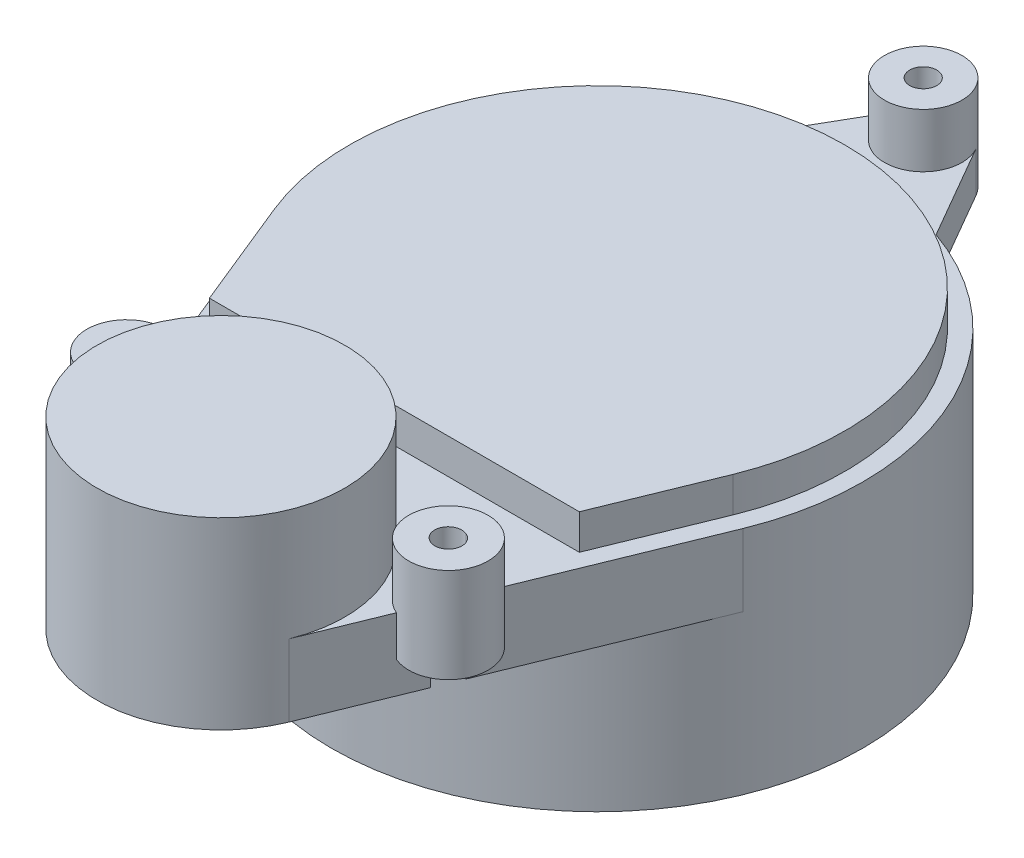
ISO-10303-21;
HEADER;
FILE_DESCRIPTION(('STEP AP214'),'2;1');
FILE_NAME('part.step','',(''),(''),'','','');
FILE_SCHEMA(('AUTOMOTIVE_DESIGN { 1 0 10303 214 1 1 1 1 }'));
ENDSEC;
DATA;
#1=APPLICATION_CONTEXT('core data for automotive mechanical design processes');
#2=APPLICATION_PROTOCOL_DEFINITION('international standard','automotive_design',2000,#1);
#3=PRODUCT_CONTEXT('',#1,'mechanical');
#4=PRODUCT('Part','Part','',(#3));
#5=PRODUCT_RELATED_PRODUCT_CATEGORY('part','',(#4));
#6=PRODUCT_DEFINITION_FORMATION('','',#4);
#7=PRODUCT_DEFINITION_CONTEXT('part definition',#1,'design');
#8=PRODUCT_DEFINITION('design','',#6,#7);
#9=PRODUCT_DEFINITION_SHAPE('','',#8);
#10=(LENGTH_UNIT() NAMED_UNIT(*) SI_UNIT(.MILLI.,.METRE.));
#11=(NAMED_UNIT(*) PLANE_ANGLE_UNIT() SI_UNIT($,.RADIAN.));
#12=(NAMED_UNIT(*) SI_UNIT($,.STERADIAN.) SOLID_ANGLE_UNIT());
#13=UNCERTAINTY_MEASURE_WITH_UNIT(LENGTH_MEASURE(1.E-05),#10,'distance_accuracy_value','');
#14=(GEOMETRIC_REPRESENTATION_CONTEXT(3) GLOBAL_UNCERTAINTY_ASSIGNED_CONTEXT((#13)) GLOBAL_UNIT_ASSIGNED_CONTEXT((#10,
#11,#12)) REPRESENTATION_CONTEXT('',''));
#15=CARTESIAN_POINT('',(0.,0.,0.));
#16=DIRECTION('',(0.,0.,1.));
#17=DIRECTION('',(1.,0.,0.));
#18=AXIS2_PLACEMENT_3D('',#15,#16,#17);
#19=CARTESIAN_POINT('',(0.,6.,3.2185628742515));
#20=DIRECTION('',(0.,1.,0.));
#21=DIRECTION('',(1.,0.,0.));
#22=AXIS2_PLACEMENT_3D('',#19,#20,#21);
#23=PLANE('',#22);
#24=CARTESIAN_POINT('',(0.,6.,-36.2));
#25=DIRECTION('',(0.,1.,0.));
#26=DIRECTION('',(-1.,0.,0.));
#27=AXIS2_PLACEMENT_3D('',#24,#25,#26);
#28=CIRCLE('',#27,4.3);
#29=CARTESIAN_POINT('',(-4.3,6.,-36.2));
#30=VERTEX_POINT('',#29);
#31=EDGE_CURVE('E674',#30,#30,#28,.T.);
#32=ORIENTED_EDGE('',*,*,#31,.T.);
#33=EDGE_LOOP('',(#32));
#34=FACE_BOUND('',#33,.T.);
#35=CARTESIAN_POINT('',(0.,6.,-36.2));
#36=DIRECTION('',(0.,1.,0.));
#37=DIRECTION('',(-1.,0.,0.));
#38=AXIS2_PLACEMENT_3D('',#35,#36,#37);
#39=CIRCLE('',#38,1.5);
#40=CARTESIAN_POINT('',(-1.5,6.,-36.2));
#41=VERTEX_POINT('',#40);
#42=EDGE_CURVE('E278',#41,#41,#39,.T.);
#43=ORIENTED_EDGE('',*,*,#42,.F.);
#44=EDGE_LOOP('',(#43));
#45=FACE_BOUND('',#44,.T.);
#46=ADVANCED_FACE('F15',(#34,#45),#23,.T.);
#47=CARTESIAN_POINT('',(0.,0.,3.2185628742515));
#48=DIRECTION('',(0.,1.,0.));
#49=DIRECTION('',(1.,0.,0.));
#50=AXIS2_PLACEMENT_3D('',#47,#48,#49);
#51=PLANE('',#50);
#52=DIRECTION('',(-0.377245508982036,0.,-0.926113290020657));
#53=VECTOR('',#52,1.);
#54=CARTESIAN_POINT('',(-20.0271998966967,0.,29.0329341317365));
#55=LINE('',#54,#53);
#56=CARTESIAN_POINT('',(-19.5091183292846,0.,30.3047908231251));
#57=VERTEX_POINT('',#56);
#58=CARTESIAN_POINT('',(-19.5092464768446,0.,30.3044762291656));
#59=VERTEX_POINT('',#58);
#60=EDGE_CURVE('E831',#57,#59,#55,.T.);
#61=ORIENTED_EDGE('',*,*,#60,.F.);
#62=CARTESIAN_POINT('',(-17.9,0.,34.4));
#63=DIRECTION('',(0.,1.,0.));
#64=DIRECTION('',(-1.,0.,0.));
#65=AXIS2_PLACEMENT_3D('',#62,#63,#64);
#66=CIRCLE('',#65,4.4);
#67=CARTESIAN_POINT('',(-19.5345313222204,0.,30.3148675227503));
#68=VERTEX_POINT('',#67);
#69=EDGE_CURVE('E723',#57,#68,#66,.T.);
#70=ORIENTED_EDGE('',*,*,#69,.T.);
#71=CARTESIAN_POINT('',(-17.8493662373236,0.,34.3793747052565));
#72=DIRECTION('',(0.,1.,0.));
#73=DIRECTION('',(-1.,0.,0.));
#74=AXIS2_PLACEMENT_3D('',#71,#72,#73);
#75=CIRCLE('',#74,4.4);
#76=EDGE_CURVE('E9',#59,#68,#75,.T.);
#77=ORIENTED_EDGE('',*,*,#76,.F.);
#78=EDGE_LOOP('',(#61,#70,#77));
#79=FACE_BOUND('',#78,.T.);
#80=ADVANCED_FACE('F322',(#79),#51,.F.);
#81=CARTESIAN_POINT('',(0.,6.,3.2185628742515));
#82=DIRECTION('',(0.,1.,0.));
#83=DIRECTION('',(1.,0.,0.));
#84=AXIS2_PLACEMENT_3D('',#81,#82,#83);
#85=PLANE('',#84);
#86=CARTESIAN_POINT('',(-17.9,6.,34.4));
#87=DIRECTION('',(0.,1.,0.));
#88=DIRECTION('',(-1.,0.,0.));
#89=AXIS2_PLACEMENT_3D('',#86,#87,#88);
#90=CIRCLE('',#89,1.5);
#91=CARTESIAN_POINT('',(-18.4148584908716,6.,32.9911278502371));
#92=VERTEX_POINT('',#91);
#93=CARTESIAN_POINT('',(-17.2838739837756,6.,35.7676215602759));
#94=VERTEX_POINT('',#93);
#95=EDGE_CURVE('E706',#92,#94,#90,.T.);
#96=ORIENTED_EDGE('',*,*,#95,.F.);
#97=CARTESIAN_POINT('',(-17.8493662373236,6.,34.3793747052565));
#98=DIRECTION('',(0.,-1.,0.));
#99=DIRECTION('',(1.,0.,0.));
#100=AXIS2_PLACEMENT_3D('',#97,#98,#99);
#101=CIRCLE('',#100,1.49900327527793);
#102=EDGE_CURVE('E268',#92,#94,#101,.T.);
#103=ORIENTED_EDGE('',*,*,#102,.T.);
#104=EDGE_LOOP('',(#96,#103));
#105=FACE_BOUND('',#104,.T.);
#106=CARTESIAN_POINT('',(-17.8493662373236,6.,34.3793747052565));
#107=DIRECTION('',(0.,1.,0.));
#108=DIRECTION('',(-1.,0.,0.));
#109=AXIS2_PLACEMENT_3D('',#106,#107,#108);
#110=CIRCLE('',#109,4.4);
#111=CARTESIAN_POINT('',(-22.2493662373236,6.,34.3793747052565));
#112=VERTEX_POINT('',#111);
#113=EDGE_CURVE('E18',#112,#112,#110,.T.);
#114=ORIENTED_EDGE('',*,*,#113,.T.);
#115=EDGE_LOOP('',(#114));
#116=FACE_BOUND('',#115,.T.);
#117=ADVANCED_FACE('F330',(#105,#116),#85,.T.);
#118=CARTESIAN_POINT('',(-17.8493662373236,6.,34.3793747052565));
#119=DIRECTION('',(0.,-1.,0.));
#120=DIRECTION('',(1.,0.,0.));
#121=AXIS2_PLACEMENT_3D('',#118,#119,#120);
#122=CYLINDRICAL_SURFACE('',#121,4.4);
#123=CARTESIAN_POINT('',(-17.8493662373236,0.,34.3793747052565));
#124=DIRECTION('',(0.,1.,0.));
#125=DIRECTION('',(-1.,0.,0.));
#126=AXIS2_PLACEMENT_3D('',#123,#124,#125);
#127=CIRCLE('',#126,4.4);
#128=CARTESIAN_POINT('',(-16.2148349151032,0.,38.4645071825062));
#129=VERTEX_POINT('',#128);
#130=CARTESIAN_POINT('',(-16.1894859978026,0.,38.4542731813474));
#131=VERTEX_POINT('',#130);
#132=EDGE_CURVE('E297',#129,#131,#127,.T.);
#133=ORIENTED_EDGE('',*,*,#132,.T.);
#134=CARTESIAN_POINT('',(-17.8493662373236,0.,34.3793747052565));
#135=DIRECTION('',(0.,1.,0.));
#136=DIRECTION('',(-1.,0.,0.));
#137=AXIS2_PLACEMENT_3D('',#134,#135,#136);
#138=CIRCLE('',#137,4.4);
#139=EDGE_CURVE('E1059',#131,#59,#138,.T.);
#140=ORIENTED_EDGE('',*,*,#139,.T.);
#141=ORIENTED_EDGE('',*,*,#76,.T.);
#142=CARTESIAN_POINT('',(-17.8493662373236,0.,34.3793747052565));
#143=DIRECTION('',(0.,1.,0.));
#144=DIRECTION('',(-1.,0.,0.));
#145=AXIS2_PLACEMENT_3D('',#142,#143,#144);
#146=CIRCLE('',#145,4.4);
#147=EDGE_CURVE('E1004',#68,#129,#146,.T.);
#148=ORIENTED_EDGE('',*,*,#147,.T.);
#149=EDGE_LOOP('',(#133,#140,#141,#148));
#150=FACE_BOUND('',#149,.T.);
#151=ORIENTED_EDGE('',*,*,#113,.F.);
#152=EDGE_LOOP('',(#151));
#153=FACE_BOUND('',#152,.T.);
#154=ADVANCED_FACE('F338',(#150,#153),#122,.T.);
#155=CARTESIAN_POINT('',(0.,0.,3.2185628742515));
#156=DIRECTION('',(0.,1.,0.));
#157=DIRECTION('',(1.,0.,0.));
#158=AXIS2_PLACEMENT_3D('',#155,#156,#157);
#159=PLANE('',#158);
#160=ORIENTED_EDGE('',*,*,#132,.F.);
#161=CARTESIAN_POINT('',(-17.9,0.,34.4));
#162=DIRECTION('',(0.,1.,0.));
#163=DIRECTION('',(-1.,0.,0.));
#164=AXIS2_PLACEMENT_3D('',#161,#162,#163);
#165=CIRCLE('',#164,4.4);
#166=CARTESIAN_POINT('',(-16.1896141453626,0.,38.4539585873879));
#167=VERTEX_POINT('',#166);
#168=EDGE_CURVE('E731',#129,#167,#165,.T.);
#169=ORIENTED_EDGE('',*,*,#168,.T.);
#170=DIRECTION('',(0.377245508982036,0.,0.926113290020657));
#171=VECTOR('',#170,1.);
#172=CARTESIAN_POINT('',(-20.0271998966967,0.,29.0329341317365));
#173=LINE('',#172,#171);
#174=EDGE_CURVE('E961',#167,#131,#173,.T.);
#175=ORIENTED_EDGE('',*,*,#174,.T.);
#176=EDGE_LOOP('',(#160,#169,#175));
#177=FACE_BOUND('',#176,.T.);
#178=ADVANCED_FACE('F344',(#177),#159,.F.);
#179=CARTESIAN_POINT('',(0.,6.,3.2185628742515));
#180=DIRECTION('',(0.,1.,0.));
#181=DIRECTION('',(1.,0.,0.));
#182=AXIS2_PLACEMENT_3D('',#179,#180,#181);
#183=PLANE('',#182);
#184=CARTESIAN_POINT('',(17.9,6.,34.4));
#185=DIRECTION('',(0.,-1.,0.));
#186=DIRECTION('',(-1.,0.,0.));
#187=AXIS2_PLACEMENT_3D('',#184,#185,#186);
#188=CIRCLE('',#187,4.4);
#189=CARTESIAN_POINT('',(13.5,6.,34.4));
#190=VERTEX_POINT('',#189);
#191=EDGE_CURVE('E40',#190,#190,#188,.T.);
#192=ORIENTED_EDGE('',*,*,#191,.F.);
#193=EDGE_LOOP('',(#192));
#194=FACE_BOUND('',#193,.T.);
#195=CARTESIAN_POINT('',(17.8493662373236,6.,34.3793747052565));
#196=DIRECTION('',(0.,-1.,0.));
#197=DIRECTION('',(1.,0.,0.));
#198=AXIS2_PLACEMENT_3D('',#195,#196,#197);
#199=CIRCLE('',#198,1.49900327527793);
#200=CARTESIAN_POINT('',(17.2838739837756,6.,35.7676215602759));
#201=VERTEX_POINT('',#200);
#202=CARTESIAN_POINT('',(18.4148584908716,6.,32.9911278502371));
#203=VERTEX_POINT('',#202);
#204=EDGE_CURVE('E255',#201,#203,#199,.T.);
#205=ORIENTED_EDGE('',*,*,#204,.T.);
#206=CARTESIAN_POINT('',(17.9,6.,34.4));
#207=DIRECTION('',(0.,-1.,0.));
#208=DIRECTION('',(-1.,0.,0.));
#209=AXIS2_PLACEMENT_3D('',#206,#207,#208);
#210=CIRCLE('',#209,1.5);
#211=EDGE_CURVE('E270',#203,#201,#210,.T.);
#212=ORIENTED_EDGE('',*,*,#211,.T.);
#213=EDGE_LOOP('',(#205,#212));
#214=FACE_BOUND('',#213,.T.);
#215=ADVANCED_FACE('F271',(#194,#214),#183,.T.);
#216=CARTESIAN_POINT('',(-17.8493662373236,110.925936694793,34.3793747052565));
#217=DIRECTION('',(0.,-1.,0.));
#218=DIRECTION('',(1.,0.,0.));
#219=AXIS2_PLACEMENT_3D('',#216,#217,#218);
#220=CYLINDRICAL_SURFACE('',#219,1.49900327527793);
#221=DIRECTION('',(0.,1.,0.));
#222=VECTOR('',#221,1.);
#223=CARTESIAN_POINT('',(-18.4148584908716,-4.5,32.9911278502371));
#224=LINE('',#223,#222);
#225=CARTESIAN_POINT('',(-18.4148584908716,-4.5,32.9911278502371));
#226=VERTEX_POINT('',#225);
#227=EDGE_CURVE('E715',#226,#92,#224,.T.);
#228=ORIENTED_EDGE('',*,*,#227,.F.);
#229=DIRECTION('',(0.,-1.,0.));
#230=VECTOR('',#229,1.);
#231=CARTESIAN_POINT('',(-18.4148584908716,110.925936694793,32.9911278502371));
#232=LINE('',#231,#230);
#233=CARTESIAN_POINT('',(-18.4148584908716,-8.,32.9911278502371));
#234=VERTEX_POINT('',#233);
#235=EDGE_CURVE('E855',#226,#234,#232,.T.);
#236=ORIENTED_EDGE('',*,*,#235,.T.);
#237=CARTESIAN_POINT('',(-17.8493662373236,-8.,34.3793747052565));
#238=DIRECTION('',(0.,-1.,0.));
#239=DIRECTION('',(1.,0.,0.));
#240=AXIS2_PLACEMENT_3D('',#237,#238,#239);
#241=CIRCLE('',#240,1.49900327527793);
#242=CARTESIAN_POINT('',(-17.2838739837756,-8.,35.7676215602759));
#243=VERTEX_POINT('',#242);
#244=EDGE_CURVE('E800',#234,#243,#241,.T.);
#245=ORIENTED_EDGE('',*,*,#244,.T.);
#246=DIRECTION('',(0.,-1.,0.));
#247=VECTOR('',#246,1.);
#248=CARTESIAN_POINT('',(-17.2838739837756,110.925936694793,35.7676215602759));
#249=LINE('',#248,#247);
#250=CARTESIAN_POINT('',(-17.2838739837756,-4.5,35.7676215602759));
#251=VERTEX_POINT('',#250);
#252=EDGE_CURVE('E981',#251,#243,#249,.T.);
#253=ORIENTED_EDGE('',*,*,#252,.F.);
#254=DIRECTION('',(0.,-1.,0.));
#255=VECTOR('',#254,1.);
#256=CARTESIAN_POINT('',(-17.2838739837756,-4.5,35.7676215602759));
#257=LINE('',#256,#255);
#258=EDGE_CURVE('E700',#94,#251,#257,.T.);
#259=ORIENTED_EDGE('',*,*,#258,.F.);
#260=ORIENTED_EDGE('',*,*,#102,.F.);
#261=EDGE_LOOP('',(#228,#236,#245,#253,#259,#260));
#262=FACE_BOUND('',#261,.T.);
#263=ADVANCED_FACE('F356',(#262),#220,.F.);
#264=CARTESIAN_POINT('',(17.8493662373236,110.925936694793,34.3793747052565));
#265=DIRECTION('',(0.,-1.,0.));
#266=DIRECTION('',(1.,0.,0.));
#267=AXIS2_PLACEMENT_3D('',#264,#265,#266);
#268=CYLINDRICAL_SURFACE('',#267,1.49900327527793);
#269=DIRECTION('',(0.,1.,0.));
#270=VECTOR('',#269,1.);
#271=CARTESIAN_POINT('',(17.2838739837756,-4.5,35.7676215602759));
#272=LINE('',#271,#270);
#273=CARTESIAN_POINT('',(17.2838739837756,-4.5,35.7676215602759));
#274=VERTEX_POINT('',#273);
#275=EDGE_CURVE('E260',#274,#201,#272,.T.);
#276=ORIENTED_EDGE('',*,*,#275,.F.);
#277=DIRECTION('',(0.,-1.,0.));
#278=VECTOR('',#277,1.);
#279=CARTESIAN_POINT('',(17.2838739837756,110.925936694793,35.7676215602759));
#280=LINE('',#279,#278);
#281=CARTESIAN_POINT('',(17.2838739837756,-8.,35.7676215602759));
#282=VERTEX_POINT('',#281);
#283=EDGE_CURVE('E952',#274,#282,#280,.T.);
#284=ORIENTED_EDGE('',*,*,#283,.T.);
#285=CARTESIAN_POINT('',(17.8493662373236,-8.,34.3793747052565));
#286=DIRECTION('',(0.,-1.,0.));
#287=DIRECTION('',(1.,0.,0.));
#288=AXIS2_PLACEMENT_3D('',#285,#286,#287);
#289=CIRCLE('',#288,1.49900327527793);
#290=CARTESIAN_POINT('',(18.4148584908716,-8.,32.9911278502371));
#291=VERTEX_POINT('',#290);
#292=EDGE_CURVE('E796',#282,#291,#289,.T.);
#293=ORIENTED_EDGE('',*,*,#292,.T.);
#294=DIRECTION('',(0.,-1.,0.));
#295=VECTOR('',#294,1.);
#296=CARTESIAN_POINT('',(18.4148584908716,110.925936694793,32.9911278502371));
#297=LINE('',#296,#295);
#298=CARTESIAN_POINT('',(18.4148584908716,-4.5,32.9911278502371));
#299=VERTEX_POINT('',#298);
#300=EDGE_CURVE('E825',#299,#291,#297,.T.);
#301=ORIENTED_EDGE('',*,*,#300,.F.);
#302=DIRECTION('',(0.,-1.,0.));
#303=VECTOR('',#302,1.);
#304=CARTESIAN_POINT('',(18.4148584908716,-4.5,32.9911278502371));
#305=LINE('',#304,#303);
#306=EDGE_CURVE('E264',#203,#299,#305,.T.);
#307=ORIENTED_EDGE('',*,*,#306,.F.);
#308=ORIENTED_EDGE('',*,*,#204,.F.);
#309=EDGE_LOOP('',(#276,#284,#293,#301,#307,#308));
#310=FACE_BOUND('',#309,.T.);
#311=ADVANCED_FACE('F257',(#310),#268,.F.);
#312=CARTESIAN_POINT('',(0.,-4.5,3.2185628742515));
#313=DIRECTION('',(0.,1.,0.));
#314=DIRECTION('',(1.,0.,0.));
#315=AXIS2_PLACEMENT_3D('',#312,#313,#314);
#316=PLANE('',#315);
#317=DIRECTION('',(-0.377245508982036,0.,0.926113290020657));
#318=VECTOR('',#317,1.);
#319=CARTESIAN_POINT('',(20.0271998966967,-4.5,29.0329341317365));
#320=LINE('',#319,#318);
#321=CARTESIAN_POINT('',(19.5091183292846,-4.5,30.3047908231251));
#322=VERTEX_POINT('',#321);
#323=EDGE_CURVE('E805',#322,#299,#320,.T.);
#324=ORIENTED_EDGE('',*,*,#323,.F.);
#325=CARTESIAN_POINT('',(17.9,-4.5,34.4));
#326=DIRECTION('',(0.,-1.,0.));
#327=DIRECTION('',(-1.,0.,0.));
#328=AXIS2_PLACEMENT_3D('',#325,#326,#327);
#329=CIRCLE('',#328,4.4);
#330=CARTESIAN_POINT('',(16.1896141453626,-4.5,38.4539585873879));
#331=VERTEX_POINT('',#330);
#332=EDGE_CURVE('E291',#322,#331,#329,.T.);
#333=ORIENTED_EDGE('',*,*,#332,.T.);
#334=DIRECTION('',(-0.377245508982036,0.,0.926113290020657));
#335=VECTOR('',#334,1.);
#336=CARTESIAN_POINT('',(20.0271998966967,-4.5,29.0329341317365));
#337=LINE('',#336,#335);
#338=EDGE_CURVE('E948',#274,#331,#337,.T.);
#339=ORIENTED_EDGE('',*,*,#338,.F.);
#340=CARTESIAN_POINT('',(17.9,-4.5,34.4));
#341=DIRECTION('',(0.,-1.,0.));
#342=DIRECTION('',(-1.,0.,0.));
#343=AXIS2_PLACEMENT_3D('',#340,#341,#342);
#344=CIRCLE('',#343,1.5);
#345=EDGE_CURVE('E276',#299,#274,#344,.T.);
#346=ORIENTED_EDGE('',*,*,#345,.F.);
#347=EDGE_LOOP('',(#324,#333,#339,#346));
#348=FACE_BOUND('',#347,.T.);
#349=ADVANCED_FACE('F370',(#348),#316,.F.);
#350=CARTESIAN_POINT('',(17.9,-4.5,34.4));
#351=DIRECTION('',(0.,1.,0.));
#352=DIRECTION('',(-1.,0.,0.));
#353=AXIS2_PLACEMENT_3D('',#350,#351,#352);
#354=CYLINDRICAL_SURFACE('',#353,4.4);
#355=ORIENTED_EDGE('',*,*,#191,.T.);
#356=EDGE_LOOP('',(#355));
#357=FACE_BOUND('',#356,.T.);
#358=DIRECTION('',(0.,-1.,0.));
#359=VECTOR('',#358,1.);
#360=CARTESIAN_POINT('',(19.5091183292846,-4.5,30.3047908231251));
#361=LINE('',#360,#359);
#362=CARTESIAN_POINT('',(19.5091183292846,0.,30.3047908231251));
#363=VERTEX_POINT('',#362);
#364=EDGE_CURVE('E813',#363,#322,#361,.T.);
#365=ORIENTED_EDGE('',*,*,#364,.F.);
#366=CARTESIAN_POINT('',(17.9,0.,34.4));
#367=DIRECTION('',(0.,-1.,0.));
#368=DIRECTION('',(-1.,0.,0.));
#369=AXIS2_PLACEMENT_3D('',#366,#367,#368);
#370=CIRCLE('',#369,4.4);
#371=CARTESIAN_POINT('',(16.1896141453626,0.,38.4539585873879));
#372=VERTEX_POINT('',#371);
#373=EDGE_CURVE('E1020',#372,#363,#370,.T.);
#374=ORIENTED_EDGE('',*,*,#373,.F.);
#375=DIRECTION('',(0.,1.,0.));
#376=VECTOR('',#375,1.);
#377=CARTESIAN_POINT('',(16.1896141453626,-4.5,38.4539585873879));
#378=LINE('',#377,#376);
#379=EDGE_CURVE('E934',#331,#372,#378,.T.);
#380=ORIENTED_EDGE('',*,*,#379,.F.);
#381=ORIENTED_EDGE('',*,*,#332,.F.);
#382=EDGE_LOOP('',(#365,#374,#380,#381));
#383=FACE_BOUND('',#382,.T.);
#384=ADVANCED_FACE('F374',(#357,#383),#354,.T.);
#385=CARTESIAN_POINT('',(17.9,-4.5,34.4));
#386=DIRECTION('',(0.,1.,0.));
#387=DIRECTION('',(-1.,0.,0.));
#388=AXIS2_PLACEMENT_3D('',#385,#386,#387);
#389=CYLINDRICAL_SURFACE('',#388,1.5);
#390=ORIENTED_EDGE('',*,*,#275,.T.);
#391=ORIENTED_EDGE('',*,*,#211,.F.);
#392=ORIENTED_EDGE('',*,*,#306,.T.);
#393=ORIENTED_EDGE('',*,*,#345,.T.);
#394=EDGE_LOOP('',(#390,#391,#392,#393));
#395=FACE_BOUND('',#394,.T.);
#396=ADVANCED_FACE('F275',(#395),#389,.F.);
#397=CARTESIAN_POINT('',(0.,-4.5,3.2185628742515));
#398=DIRECTION('',(0.,1.,0.));
#399=DIRECTION('',(1.,0.,0.));
#400=AXIS2_PLACEMENT_3D('',#397,#398,#399);
#401=PLANE('',#400);
#402=CARTESIAN_POINT('',(0.,-4.5,-36.2));
#403=DIRECTION('',(0.,1.,0.));
#404=DIRECTION('',(-1.,0.,0.));
#405=AXIS2_PLACEMENT_3D('',#402,#403,#404);
#406=CIRCLE('',#405,1.5);
#407=CARTESIAN_POINT('',(-1.5,-4.5,-36.2));
#408=VERTEX_POINT('',#407);
#409=EDGE_CURVE('E283',#408,#408,#406,.T.);
#410=ORIENTED_EDGE('',*,*,#409,.T.);
#411=EDGE_LOOP('',(#410));
#412=FACE_BOUND('',#411,.T.);
#413=DIRECTION('',(0.5,0.,0.866025403784439));
#414=VECTOR('',#413,1.);
#415=CARTESIAN_POINT('',(6.76241580238355,-4.5,-33.0871522483651));
#416=LINE('',#415,#414);
#417=CARTESIAN_POINT('',(3.72390923627309,-4.5,-38.35));
#418=VERTEX_POINT('',#417);
#419=CARTESIAN_POINT('',(9.80092236849401,-4.5,-27.8243044967301));
#420=VERTEX_POINT('',#419);
#421=EDGE_CURVE('E705',#418,#420,#416,.T.);
#422=ORIENTED_EDGE('',*,*,#421,.T.);
#423=CARTESIAN_POINT('',(0.,-4.5,0.));
#424=DIRECTION('',(0.,-1.,0.));
#425=DIRECTION('',(1.,0.,0.));
#426=AXIS2_PLACEMENT_3D('',#423,#424,#425);
#427=CIRCLE('',#426,29.5);
#428=CARTESIAN_POINT('',(-9.800922368494,-4.5,-27.8243044967301));
#429=VERTEX_POINT('',#428);
#430=EDGE_CURVE('E911',#429,#420,#427,.T.);
#431=ORIENTED_EDGE('',*,*,#430,.F.);
#432=DIRECTION('',(-0.5,0.,0.866025403784439));
#433=VECTOR('',#432,1.);
#434=CARTESIAN_POINT('',(-6.76241580238355,-4.5,-33.0871522483651));
#435=LINE('',#434,#433);
#436=CARTESIAN_POINT('',(-3.72390923627309,-4.5,-38.35));
#437=VERTEX_POINT('',#436);
#438=EDGE_CURVE('E668',#437,#429,#435,.T.);
#439=ORIENTED_EDGE('',*,*,#438,.F.);
#440=CARTESIAN_POINT('',(0.,-4.5,-36.2));
#441=DIRECTION('',(0.,1.,0.));
#442=DIRECTION('',(-1.,0.,0.));
#443=AXIS2_PLACEMENT_3D('',#440,#441,#442);
#444=CIRCLE('',#443,4.3);
#445=EDGE_CURVE('E681',#418,#437,#444,.T.);
#446=ORIENTED_EDGE('',*,*,#445,.F.);
#447=EDGE_LOOP('',(#422,#431,#439,#446));
#448=FACE_BOUND('',#447,.T.);
#449=ADVANCED_FACE('F383',(#412,#448),#401,.F.);
#450=CARTESIAN_POINT('',(0.,-4.5,-36.2));
#451=DIRECTION('',(0.,1.,0.));
#452=DIRECTION('',(-1.,0.,0.));
#453=AXIS2_PLACEMENT_3D('',#450,#451,#452);
#454=CYLINDRICAL_SURFACE('',#453,1.5);
#455=ORIENTED_EDGE('',*,*,#42,.T.);
#456=EDGE_LOOP('',(#455));
#457=FACE_BOUND('',#456,.T.);
#458=ORIENTED_EDGE('',*,*,#409,.F.);
#459=EDGE_LOOP('',(#458));
#460=FACE_BOUND('',#459,.T.);
#461=ADVANCED_FACE('F391',(#457,#460),#454,.F.);
#462=CARTESIAN_POINT('',(-6.76241580238355,-4.5,-33.0871522483651));
#463=DIRECTION('',(-0.866025403784439,0.,-0.5));
#464=DIRECTION('',(-0.5,0.,0.866025403784439));
#465=AXIS2_PLACEMENT_3D('',#462,#463,#464);
#466=PLANE('',#465);
#467=DIRECTION('',(-0.5,0.,0.866025403784439));
#468=VECTOR('',#467,1.);
#469=CARTESIAN_POINT('',(-6.76241580238355,0.,-33.0871522483651));
#470=LINE('',#469,#468);
#471=CARTESIAN_POINT('',(-3.72390923627309,0.,-38.35));
#472=VERTEX_POINT('',#471);
#473=CARTESIAN_POINT('',(-9.80092236849402,0.,-27.8243044967301));
#474=VERTEX_POINT('',#473);
#475=EDGE_CURVE('E1087',#472,#474,#470,.T.);
#476=ORIENTED_EDGE('',*,*,#475,.F.);
#477=DIRECTION('',(0.,1.,0.));
#478=VECTOR('',#477,1.);
#479=CARTESIAN_POINT('',(-3.72390923627309,-4.5,-38.35));
#480=LINE('',#479,#478);
#481=EDGE_CURVE('E689',#437,#472,#480,.T.);
#482=ORIENTED_EDGE('',*,*,#481,.F.);
#483=ORIENTED_EDGE('',*,*,#438,.T.);
#484=DIRECTION('',(0.,1.,0.));
#485=VECTOR('',#484,1.);
#486=CARTESIAN_POINT('',(-9.800922368494,-4.5,-27.8243044967301));
#487=LINE('',#486,#485);
#488=EDGE_CURVE('E924',#429,#474,#487,.T.);
#489=ORIENTED_EDGE('',*,*,#488,.T.);
#490=EDGE_LOOP('',(#476,#482,#483,#489));
#491=FACE_BOUND('',#490,.T.);
#492=ADVANCED_FACE('F400',(#491),#466,.T.);
#493=CARTESIAN_POINT('',(0.,-4.5,-36.2));
#494=DIRECTION('',(0.,1.,0.));
#495=DIRECTION('',(-1.,0.,0.));
#496=AXIS2_PLACEMENT_3D('',#493,#494,#495);
#497=CYLINDRICAL_SURFACE('',#496,4.3);
#498=ORIENTED_EDGE('',*,*,#31,.F.);
#499=EDGE_LOOP('',(#498));
#500=FACE_BOUND('',#499,.T.);
#501=ORIENTED_EDGE('',*,*,#481,.T.);
#502=CARTESIAN_POINT('',(0.,0.,-36.2));
#503=DIRECTION('',(0.,1.,0.));
#504=DIRECTION('',(-1.,0.,0.));
#505=AXIS2_PLACEMENT_3D('',#502,#503,#504);
#506=CIRCLE('',#505,4.3);
#507=CARTESIAN_POINT('',(3.72390923627309,0.,-38.35));
#508=VERTEX_POINT('',#507);
#509=EDGE_CURVE('E1096',#472,#508,#506,.T.);
#510=ORIENTED_EDGE('',*,*,#509,.T.);
#511=DIRECTION('',(0.,1.,0.));
#512=VECTOR('',#511,1.);
#513=CARTESIAN_POINT('',(3.72390923627309,-4.5,-38.35));
#514=LINE('',#513,#512);
#515=EDGE_CURVE('E696',#418,#508,#514,.T.);
#516=ORIENTED_EDGE('',*,*,#515,.F.);
#517=ORIENTED_EDGE('',*,*,#445,.T.);
#518=EDGE_LOOP('',(#501,#510,#516,#517));
#519=FACE_BOUND('',#518,.T.);
#520=ADVANCED_FACE('F409',(#500,#519),#497,.T.);
#521=CARTESIAN_POINT('',(6.76241580238355,-4.5,-33.0871522483651));
#522=DIRECTION('',(-0.866025403784439,0.,0.5));
#523=DIRECTION('',(0.,1.,0.));
#524=AXIS2_PLACEMENT_3D('',#521,#522,#523);
#525=PLANE('',#524);
#526=DIRECTION('',(0.5,0.,0.866025403784439));
#527=VECTOR('',#526,1.);
#528=CARTESIAN_POINT('',(6.76241580238355,0.,-33.0871522483651));
#529=LINE('',#528,#527);
#530=CARTESIAN_POINT('',(9.80092236849402,0.,-27.8243044967301));
#531=VERTEX_POINT('',#530);
#532=EDGE_CURVE('E1010',#508,#531,#529,.T.);
#533=ORIENTED_EDGE('',*,*,#532,.T.);
#534=DIRECTION('',(0.,1.,0.));
#535=VECTOR('',#534,1.);
#536=CARTESIAN_POINT('',(9.80092236849401,-4.5,-27.8243044967301));
#537=LINE('',#536,#535);
#538=EDGE_CURVE('E894',#420,#531,#537,.T.);
#539=ORIENTED_EDGE('',*,*,#538,.F.);
#540=ORIENTED_EDGE('',*,*,#421,.F.);
#541=ORIENTED_EDGE('',*,*,#515,.T.);
#542=EDGE_LOOP('',(#533,#539,#540,#541));
#543=FACE_BOUND('',#542,.T.);
#544=ADVANCED_FACE('F420',(#543),#525,.F.);
#545=CARTESIAN_POINT('',(-17.9,-4.5,34.4));
#546=DIRECTION('',(0.,1.,0.));
#547=DIRECTION('',(-1.,0.,0.));
#548=AXIS2_PLACEMENT_3D('',#545,#546,#547);
#549=CYLINDRICAL_SURFACE('',#548,1.5);
#550=CARTESIAN_POINT('',(-17.9,-4.5,34.4));
#551=DIRECTION('',(0.,1.,0.));
#552=DIRECTION('',(-1.,0.,0.));
#553=AXIS2_PLACEMENT_3D('',#550,#551,#552);
#554=CIRCLE('',#553,1.5);
#555=EDGE_CURVE('E738',#226,#251,#554,.T.);
#556=ORIENTED_EDGE('',*,*,#555,.F.);
#557=ORIENTED_EDGE('',*,*,#227,.T.);
#558=ORIENTED_EDGE('',*,*,#95,.T.);
#559=ORIENTED_EDGE('',*,*,#258,.T.);
#560=EDGE_LOOP('',(#556,#557,#558,#559));
#561=FACE_BOUND('',#560,.T.);
#562=ADVANCED_FACE('F415',(#561),#549,.F.);
#563=CARTESIAN_POINT('',(-17.9,-4.5,34.4));
#564=DIRECTION('',(0.,1.,0.));
#565=DIRECTION('',(-1.,0.,0.));
#566=AXIS2_PLACEMENT_3D('',#563,#564,#565);
#567=CYLINDRICAL_SURFACE('',#566,4.4);
#568=DIRECTION('',(0.,1.,0.));
#569=VECTOR('',#568,1.);
#570=CARTESIAN_POINT('',(-19.5091183292846,-4.5,30.3047908231251));
#571=LINE('',#570,#569);
#572=CARTESIAN_POINT('',(-19.5091183292846,-4.5,30.3047908231251));
#573=VERTEX_POINT('',#572);
#574=EDGE_CURVE('E839',#573,#57,#571,.T.);
#575=ORIENTED_EDGE('',*,*,#574,.F.);
#576=CARTESIAN_POINT('',(-17.9,-4.5,34.4));
#577=DIRECTION('',(0.,1.,0.));
#578=DIRECTION('',(-1.,0.,0.));
#579=AXIS2_PLACEMENT_3D('',#576,#577,#578);
#580=CIRCLE('',#579,4.4);
#581=CARTESIAN_POINT('',(-16.1896141453626,-4.5,38.4539585873879));
#582=VERTEX_POINT('',#581);
#583=EDGE_CURVE('E746',#573,#582,#580,.T.);
#584=ORIENTED_EDGE('',*,*,#583,.T.);
#585=DIRECTION('',(0.,-1.,0.));
#586=VECTOR('',#585,1.);
#587=CARTESIAN_POINT('',(-16.1896141453626,-4.5,38.4539585873879));
#588=LINE('',#587,#586);
#589=EDGE_CURVE('E957',#167,#582,#588,.T.);
#590=ORIENTED_EDGE('',*,*,#589,.F.);
#591=ORIENTED_EDGE('',*,*,#168,.F.);
#592=CARTESIAN_POINT('',(-17.9,0.,34.4));
#593=DIRECTION('',(0.,1.,0.));
#594=DIRECTION('',(-1.,0.,0.));
#595=AXIS2_PLACEMENT_3D('',#592,#593,#594);
#596=CIRCLE('',#595,4.4);
#597=EDGE_CURVE('E998',#68,#129,#596,.T.);
#598=ORIENTED_EDGE('',*,*,#597,.F.);
#599=ORIENTED_EDGE('',*,*,#69,.F.);
#600=EDGE_LOOP('',(#575,#584,#590,#591,#598,#599));
#601=FACE_BOUND('',#600,.T.);
#602=ADVANCED_FACE('F419',(#601),#567,.T.);
#603=CARTESIAN_POINT('',(0.,-4.5,3.2185628742515));
#604=DIRECTION('',(0.,1.,0.));
#605=DIRECTION('',(1.,0.,0.));
#606=AXIS2_PLACEMENT_3D('',#603,#604,#605);
#607=PLANE('',#606);
#608=ORIENTED_EDGE('',*,*,#583,.F.);
#609=DIRECTION('',(0.377245508982036,0.,0.926113290020657));
#610=VECTOR('',#609,1.);
#611=CARTESIAN_POINT('',(-20.0271998966967,-4.5,29.0329341317365));
#612=LINE('',#611,#610);
#613=EDGE_CURVE('E847',#573,#226,#612,.T.);
#614=ORIENTED_EDGE('',*,*,#613,.T.);
#615=ORIENTED_EDGE('',*,*,#555,.T.);
#616=DIRECTION('',(0.377245508982036,0.,0.926113290020657));
#617=VECTOR('',#616,1.);
#618=CARTESIAN_POINT('',(-20.0271998966967,-4.5,29.0329341317365));
#619=LINE('',#618,#617);
#620=EDGE_CURVE('E989',#251,#582,#619,.T.);
#621=ORIENTED_EDGE('',*,*,#620,.T.);
#622=EDGE_LOOP('',(#608,#614,#615,#621));
#623=FACE_BOUND('',#622,.T.);
#624=ADVANCED_FACE('F429',(#623),#607,.F.);
#625=CARTESIAN_POINT('',(0.,3.9,8.7185628742515));
#626=DIRECTION('',(0.,1.,0.));
#627=DIRECTION('',(1.,0.,0.));
#628=AXIS2_PLACEMENT_3D('',#625,#626,#627);
#629=PLANE('',#628);
#630=DIRECTION('',(-0.377245508982036,0.,-0.926113290020656));
#631=VECTOR('',#630,1.);
#632=CARTESIAN_POINT('',(-22.998447771254,3.9,16.437125748503));
#633=LINE('',#632,#631);
#634=CARTESIAN_POINT('',(-20.5287800669399,3.9,22.5));
#635=VERTEX_POINT('',#634);
#636=CARTESIAN_POINT('',(-25.468115475568,3.9,10.374251497006));
#637=VERTEX_POINT('',#636);
#638=EDGE_CURVE('E781',#635,#637,#633,.T.);
#639=ORIENTED_EDGE('',*,*,#638,.F.);
#640=DIRECTION('',(1.,0.,0.));
#641=VECTOR('',#640,1.);
#642=CARTESIAN_POINT('',(0.,3.9,22.5));
#643=LINE('',#642,#641);
#644=CARTESIAN_POINT('',(20.5287800669399,3.9,22.5));
#645=VERTEX_POINT('',#644);
#646=EDGE_CURVE('E759',#635,#645,#643,.T.);
#647=ORIENTED_EDGE('',*,*,#646,.T.);
#648=DIRECTION('',(0.377245508982036,0.,-0.926113290020657));
#649=VECTOR('',#648,1.);
#650=CARTESIAN_POINT('',(22.998447771254,3.9,16.437125748503));
#651=LINE('',#650,#649);
#652=CARTESIAN_POINT('',(25.468115475568,3.9,10.374251497006));
#653=VERTEX_POINT('',#652);
#654=EDGE_CURVE('E755',#645,#653,#651,.T.);
#655=ORIENTED_EDGE('',*,*,#654,.T.);
#656=CARTESIAN_POINT('',(0.,3.9,0.));
#657=DIRECTION('',(0.,-1.,0.));
#658=DIRECTION('',(-1.,0.,0.));
#659=AXIS2_PLACEMENT_3D('',#656,#657,#658);
#660=CIRCLE('',#659,27.5);
#661=EDGE_CURVE('E750',#637,#653,#660,.T.);
#662=ORIENTED_EDGE('',*,*,#661,.F.);
#663=EDGE_LOOP('',(#639,#647,#655,#662));
#664=FACE_BOUND('',#663,.T.);
#665=ADVANCED_FACE('F438',(#664),#629,.T.);
#666=CARTESIAN_POINT('',(0.,3.9,0.));
#667=DIRECTION('',(0.,-1.,0.));
#668=DIRECTION('',(1.,0.,0.));
#669=AXIS2_PLACEMENT_3D('',#666,#667,#668);
#670=CYLINDRICAL_SURFACE('',#669,27.5);
#671=CARTESIAN_POINT('',(0.,0.,0.));
#672=DIRECTION('',(0.,-1.,0.));
#673=DIRECTION('',(-1.,0.,0.));
#674=AXIS2_PLACEMENT_3D('',#671,#672,#673);
#675=CIRCLE('',#674,27.5);
#676=CARTESIAN_POINT('',(-25.468115475568,0.,10.374251497006));
#677=VERTEX_POINT('',#676);
#678=CARTESIAN_POINT('',(25.468115475568,0.,10.374251497006));
#679=VERTEX_POINT('',#678);
#680=EDGE_CURVE('E1113',#677,#679,#675,.T.);
#681=ORIENTED_EDGE('',*,*,#680,.F.);
#682=DIRECTION('',(0.,-1.,0.));
#683=VECTOR('',#682,1.);
#684=CARTESIAN_POINT('',(-25.468115475568,3.9,10.374251497006));
#685=LINE('',#684,#683);
#686=EDGE_CURVE('E774',#637,#677,#685,.T.);
#687=ORIENTED_EDGE('',*,*,#686,.F.);
#688=ORIENTED_EDGE('',*,*,#661,.T.);
#689=DIRECTION('',(0.,-1.,0.));
#690=VECTOR('',#689,1.);
#691=CARTESIAN_POINT('',(25.468115475568,3.9,10.374251497006));
#692=LINE('',#691,#690);
#693=EDGE_CURVE('E765',#653,#679,#692,.T.);
#694=ORIENTED_EDGE('',*,*,#693,.T.);
#695=EDGE_LOOP('',(#681,#687,#688,#694));
#696=FACE_BOUND('',#695,.T.);
#697=ADVANCED_FACE('F454',(#696),#670,.T.);
#698=CARTESIAN_POINT('',(22.998447771254,3.9,16.437125748503));
#699=DIRECTION('',(-0.926113290020657,0.,-0.377245508982036));
#700=DIRECTION('',(-0.377245508982036,0.,0.926113290020657));
#701=AXIS2_PLACEMENT_3D('',#698,#699,#700);
#702=PLANE('',#701);
#703=DIRECTION('',(0.377245508982036,0.,-0.926113290020657));
#704=VECTOR('',#703,1.);
#705=CARTESIAN_POINT('',(22.998447771254,0.,16.437125748503));
#706=LINE('',#705,#704);
#707=CARTESIAN_POINT('',(20.5287800669399,0.,22.5));
#708=VERTEX_POINT('',#707);
#709=EDGE_CURVE('E1104',#708,#679,#706,.T.);
#710=ORIENTED_EDGE('',*,*,#709,.T.);
#711=ORIENTED_EDGE('',*,*,#693,.F.);
#712=ORIENTED_EDGE('',*,*,#654,.F.);
#713=DIRECTION('',(0.,-1.,0.));
#714=VECTOR('',#713,1.);
#715=CARTESIAN_POINT('',(20.5287800669399,3.9,22.5));
#716=LINE('',#715,#714);
#717=EDGE_CURVE('E766',#645,#708,#716,.T.);
#718=ORIENTED_EDGE('',*,*,#717,.T.);
#719=EDGE_LOOP('',(#710,#711,#712,#718));
#720=FACE_BOUND('',#719,.T.);
#721=ADVANCED_FACE('F473',(#720),#702,.F.);
#722=CARTESIAN_POINT('',(0.,3.9,22.5));
#723=DIRECTION('',(0.,0.,-1.));
#724=DIRECTION('',(0.,-1.,0.));
#725=AXIS2_PLACEMENT_3D('',#722,#723,#724);
#726=PLANE('',#725);
#727=DIRECTION('',(1.,0.,0.));
#728=VECTOR('',#727,1.);
#729=CARTESIAN_POINT('',(0.,0.,22.5));
#730=LINE('',#729,#728);
#731=CARTESIAN_POINT('',(-20.5287800669399,0.,22.5));
#732=VERTEX_POINT('',#731);
#733=EDGE_CURVE('E1131',#732,#708,#730,.T.);
#734=ORIENTED_EDGE('',*,*,#733,.T.);
#735=ORIENTED_EDGE('',*,*,#717,.F.);
#736=ORIENTED_EDGE('',*,*,#646,.F.);
#737=DIRECTION('',(0.,-1.,0.));
#738=VECTOR('',#737,1.);
#739=CARTESIAN_POINT('',(-20.5287800669399,3.9,22.5));
#740=LINE('',#739,#738);
#741=EDGE_CURVE('E789',#635,#732,#740,.T.);
#742=ORIENTED_EDGE('',*,*,#741,.T.);
#743=EDGE_LOOP('',(#734,#735,#736,#742));
#744=FACE_BOUND('',#743,.T.);
#745=ADVANCED_FACE('F468',(#744),#726,.F.);
#746=CARTESIAN_POINT('',(-22.998447771254,3.9,16.437125748503));
#747=DIRECTION('',(-0.926113290020656,0.,0.377245508982036));
#748=DIRECTION('',(0.,1.,0.));
#749=AXIS2_PLACEMENT_3D('',#746,#747,#748);
#750=PLANE('',#749);
#751=DIRECTION('',(-0.377245508982036,0.,-0.926113290020656));
#752=VECTOR('',#751,1.);
#753=CARTESIAN_POINT('',(-22.998447771254,0.,16.437125748503));
#754=LINE('',#753,#752);
#755=EDGE_CURVE('E1122',#732,#677,#754,.T.);
#756=ORIENTED_EDGE('',*,*,#755,.F.);
#757=ORIENTED_EDGE('',*,*,#741,.F.);
#758=ORIENTED_EDGE('',*,*,#638,.T.);
#759=ORIENTED_EDGE('',*,*,#686,.T.);
#760=EDGE_LOOP('',(#756,#757,#758,#759));
#761=FACE_BOUND('',#760,.T.);
#762=ADVANCED_FACE('F472',(#761),#750,.T.);
#763=CARTESIAN_POINT('',(0.,12.4,13.));
#764=DIRECTION('',(0.,1.,0.));
#765=DIRECTION('',(1.,0.,0.));
#766=AXIS2_PLACEMENT_3D('',#763,#764,#765);
#767=PLANE('',#766);
#768=CARTESIAN_POINT('',(0.,12.4,41.75));
#769=DIRECTION('',(0.,-1.,0.));
#770=DIRECTION('',(1.,0.,0.));
#771=AXIS2_PLACEMENT_3D('',#768,#769,#770);
#772=CIRCLE('',#771,13.75);
#773=CARTESIAN_POINT('',(13.75,12.4,41.75));
#774=VERTEX_POINT('',#773);
#775=EDGE_CURVE('E870',#774,#774,#772,.T.);
#776=ORIENTED_EDGE('',*,*,#775,.F.);
#777=EDGE_LOOP('',(#776));
#778=FACE_BOUND('',#777,.T.);
#779=ADVANCED_FACE('F490',(#778),#767,.T.);
#780=CARTESIAN_POINT('',(0.,-25.6,13.));
#781=DIRECTION('',(0.,-1.,0.));
#782=DIRECTION('',(0.,0.,-1.));
#783=AXIS2_PLACEMENT_3D('',#780,#781,#782);
#784=PLANE('',#783);
#785=CARTESIAN_POINT('',(0.,-25.6,0.));
#786=DIRECTION('',(0.,-1.,0.));
#787=DIRECTION('',(1.,0.,0.));
#788=AXIS2_PLACEMENT_3D('',#785,#786,#787);
#789=CIRCLE('',#788,29.5);
#790=CARTESIAN_POINT('',(29.5,-25.6,0.));
#791=VERTEX_POINT('',#790);
#792=EDGE_CURVE('E1145',#791,#791,#789,.T.);
#793=ORIENTED_EDGE('',*,*,#792,.T.);
#794=EDGE_LOOP('',(#793));
#795=FACE_BOUND('',#794,.T.);
#796=ADVANCED_FACE('F499',(#795),#784,.T.);
#797=CARTESIAN_POINT('',(0.,-8.,13.));
#798=DIRECTION('',(0.,-1.,0.));
#799=DIRECTION('',(0.,0.,-1.));
#800=AXIS2_PLACEMENT_3D('',#797,#798,#799);
#801=PLANE('',#800);
#802=ORIENTED_EDGE('',*,*,#244,.F.);
#803=DIRECTION('',(-0.377245508982036,0.,-0.926113290020657));
#804=VECTOR('',#803,1.);
#805=CARTESIAN_POINT('',(-20.0271998966967,-8.,29.0329341317365));
#806=LINE('',#805,#804);
#807=CARTESIAN_POINT('',(-27.3203420556094,-8.,11.12874251497));
#808=VERTEX_POINT('',#807);
#809=EDGE_CURVE('E863',#234,#808,#806,.T.);
#810=ORIENTED_EDGE('',*,*,#809,.T.);
#811=CARTESIAN_POINT('',(0.,-8.,0.));
#812=DIRECTION('',(0.,-1.,0.));
#813=DIRECTION('',(1.,0.,0.));
#814=AXIS2_PLACEMENT_3D('',#811,#812,#813);
#815=CIRCLE('',#814,29.5);
#816=CARTESIAN_POINT('',(27.3203420556094,-8.,11.1287425149701));
#817=VERTEX_POINT('',#816);
#818=EDGE_CURVE('E893',#817,#808,#815,.T.);
#819=ORIENTED_EDGE('',*,*,#818,.F.);
#820=DIRECTION('',(0.377245508982036,0.,-0.926113290020657));
#821=VECTOR('',#820,1.);
#822=CARTESIAN_POINT('',(20.0271998966967,-8.,29.0329341317365));
#823=LINE('',#822,#821);
#824=EDGE_CURVE('E821',#291,#817,#823,.T.);
#825=ORIENTED_EDGE('',*,*,#824,.F.);
#826=ORIENTED_EDGE('',*,*,#292,.F.);
#827=DIRECTION('',(0.377245508982036,0.,-0.926113290020657));
#828=VECTOR('',#827,1.);
#829=CARTESIAN_POINT('',(20.0271998966967,-8.,29.0329341317365));
#830=LINE('',#829,#828);
#831=CARTESIAN_POINT('',(12.734057737784,-8.,46.937125748503));
#832=VERTEX_POINT('',#831);
#833=EDGE_CURVE('E933',#832,#282,#830,.T.);
#834=ORIENTED_EDGE('',*,*,#833,.F.);
#835=CARTESIAN_POINT('',(0.,-8.,41.75));
#836=DIRECTION('',(0.,-1.,0.));
#837=DIRECTION('',(1.,0.,0.));
#838=AXIS2_PLACEMENT_3D('',#835,#836,#837);
#839=CIRCLE('',#838,13.75);
#840=CARTESIAN_POINT('',(-12.734057737784,-8.,46.937125748503));
#841=VERTEX_POINT('',#840);
#842=EDGE_CURVE('E877',#832,#841,#839,.T.);
#843=ORIENTED_EDGE('',*,*,#842,.T.);
#844=DIRECTION('',(-0.377245508982036,0.,-0.926113290020657));
#845=VECTOR('',#844,1.);
#846=CARTESIAN_POINT('',(-20.0271998966967,-8.,29.0329341317365));
#847=LINE('',#846,#845);
#848=EDGE_CURVE('E973',#841,#243,#847,.T.);
#849=ORIENTED_EDGE('',*,*,#848,.T.);
#850=EDGE_LOOP('',(#802,#810,#819,#825,#826,#834,#843,#849));
#851=FACE_BOUND('',#850,.T.);
#852=ADVANCED_FACE('F505',(#851),#801,.T.);
#853=CARTESIAN_POINT('',(20.0271998966967,-8.,29.0329341317365));
#854=DIRECTION('',(0.926113290020657,0.,0.377245508982036));
#855=DIRECTION('',(0.,-1.,0.));
#856=AXIS2_PLACEMENT_3D('',#853,#854,#855);
#857=PLANE('',#856);
#858=ORIENTED_EDGE('',*,*,#300,.T.);
#859=ORIENTED_EDGE('',*,*,#824,.T.);
#860=DIRECTION('',(0.,1.,0.));
#861=VECTOR('',#860,1.);
#862=CARTESIAN_POINT('',(27.3203420556094,-8.,11.1287425149701));
#863=LINE('',#862,#861);
#864=CARTESIAN_POINT('',(27.3203420556094,0.,11.1287425149701));
#865=VERTEX_POINT('',#864);
#866=EDGE_CURVE('E888',#817,#865,#863,.T.);
#867=ORIENTED_EDGE('',*,*,#866,.T.);
#868=DIRECTION('',(0.377245508982036,0.,-0.926113290020657));
#869=VECTOR('',#868,1.);
#870=CARTESIAN_POINT('',(20.0271998966967,0.,29.0329341317365));
#871=LINE('',#870,#869);
#872=EDGE_CURVE('E1014',#363,#865,#871,.T.);
#873=ORIENTED_EDGE('',*,*,#872,.F.);
#874=ORIENTED_EDGE('',*,*,#364,.T.);
#875=ORIENTED_EDGE('',*,*,#323,.T.);
#876=EDGE_LOOP('',(#858,#859,#867,#873,#874,#875));
#877=FACE_BOUND('',#876,.T.);
#878=ADVANCED_FACE('F509',(#877),#857,.T.);
#879=CARTESIAN_POINT('',(-20.0271998966967,-8.,29.0329341317365));
#880=DIRECTION('',(0.926113290020657,0.,-0.377245508982036));
#881=DIRECTION('',(0.,-1.,0.));
#882=AXIS2_PLACEMENT_3D('',#879,#880,#881);
#883=PLANE('',#882);
#884=ORIENTED_EDGE('',*,*,#809,.F.);
#885=ORIENTED_EDGE('',*,*,#235,.F.);
#886=ORIENTED_EDGE('',*,*,#613,.F.);
#887=ORIENTED_EDGE('',*,*,#574,.T.);
#888=ORIENTED_EDGE('',*,*,#60,.T.);
#889=DIRECTION('',(-0.377245508982036,0.,-0.926113290020657));
#890=VECTOR('',#889,1.);
#891=CARTESIAN_POINT('',(-20.0271998966967,0.,29.0329341317365));
#892=LINE('',#891,#890);
#893=CARTESIAN_POINT('',(-27.3203420556094,0.,11.12874251497));
#894=VERTEX_POINT('',#893);
#895=EDGE_CURVE('E1067',#59,#894,#892,.T.);
#896=ORIENTED_EDGE('',*,*,#895,.T.);
#897=DIRECTION('',(0.,1.,0.));
#898=VECTOR('',#897,1.);
#899=CARTESIAN_POINT('',(-27.3203420556094,-8.,11.12874251497));
#900=LINE('',#899,#898);
#901=EDGE_CURVE('E884',#808,#894,#900,.T.);
#902=ORIENTED_EDGE('',*,*,#901,.F.);
#903=EDGE_LOOP('',(#884,#885,#886,#887,#888,#896,#902));
#904=FACE_BOUND('',#903,.T.);
#905=ADVANCED_FACE('F515',(#904),#883,.F.);
#906=CARTESIAN_POINT('',(0.,-8.,41.75));
#907=DIRECTION('',(0.,1.,0.));
#908=DIRECTION('',(-1.,0.,0.));
#909=AXIS2_PLACEMENT_3D('',#906,#907,#908);
#910=CYLINDRICAL_SURFACE('',#909,13.75);
#911=ORIENTED_EDGE('',*,*,#775,.T.);
#912=EDGE_LOOP('',(#911));
#913=FACE_BOUND('',#912,.T.);
#914=DIRECTION('',(0.,1.,0.));
#915=VECTOR('',#914,1.);
#916=CARTESIAN_POINT('',(12.734057737784,-8.,46.937125748503));
#917=LINE('',#916,#915);
#918=CARTESIAN_POINT('',(12.734057737784,0.,46.937125748503));
#919=VERTEX_POINT('',#918);
#920=EDGE_CURVE('E928',#832,#919,#917,.T.);
#921=ORIENTED_EDGE('',*,*,#920,.T.);
#922=CARTESIAN_POINT('',(0.,0.,41.75));
#923=DIRECTION('',(0.,-1.,0.));
#924=DIRECTION('',(1.,0.,0.));
#925=AXIS2_PLACEMENT_3D('',#922,#923,#924);
#926=CIRCLE('',#925,13.75);
#927=CARTESIAN_POINT('',(-12.734057737784,0.,46.937125748503));
#928=VERTEX_POINT('',#927);
#929=EDGE_CURVE('E1042',#928,#919,#926,.T.);
#930=ORIENTED_EDGE('',*,*,#929,.F.);
#931=DIRECTION('',(0.,1.,0.));
#932=VECTOR('',#931,1.);
#933=CARTESIAN_POINT('',(-12.734057737784,-8.,46.937125748503));
#934=LINE('',#933,#932);
#935=EDGE_CURVE('E966',#841,#928,#934,.T.);
#936=ORIENTED_EDGE('',*,*,#935,.F.);
#937=ORIENTED_EDGE('',*,*,#842,.F.);
#938=EDGE_LOOP('',(#921,#930,#936,#937));
#939=FACE_BOUND('',#938,.T.);
#940=ADVANCED_FACE('F519',(#913,#939),#910,.T.);
#941=CARTESIAN_POINT('',(0.,-8.,0.));
#942=DIRECTION('',(0.,1.,0.));
#943=DIRECTION('',(-1.,0.,0.));
#944=AXIS2_PLACEMENT_3D('',#941,#942,#943);
#945=CYLINDRICAL_SURFACE('',#944,29.5);
#946=ORIENTED_EDGE('',*,*,#488,.F.);
#947=ORIENTED_EDGE('',*,*,#430,.T.);
#948=ORIENTED_EDGE('',*,*,#538,.T.);
#949=CARTESIAN_POINT('',(0.,0.,0.));
#950=DIRECTION('',(0.,-1.,0.));
#951=DIRECTION('',(1.,0.,0.));
#952=AXIS2_PLACEMENT_3D('',#949,#950,#951);
#953=CIRCLE('',#952,29.5);
#954=EDGE_CURVE('E1019',#531,#865,#953,.T.);
#955=ORIENTED_EDGE('',*,*,#954,.T.);
#956=ORIENTED_EDGE('',*,*,#866,.F.);
#957=ORIENTED_EDGE('',*,*,#818,.T.);
#958=ORIENTED_EDGE('',*,*,#901,.T.);
#959=CARTESIAN_POINT('',(0.,0.,0.));
#960=DIRECTION('',(0.,-1.,0.));
#961=DIRECTION('',(1.,0.,0.));
#962=AXIS2_PLACEMENT_3D('',#959,#960,#961);
#963=CIRCLE('',#962,29.5);
#964=EDGE_CURVE('E1077',#894,#474,#963,.T.);
#965=ORIENTED_EDGE('',*,*,#964,.T.);
#966=EDGE_LOOP('',(#946,#947,#948,#955,#956,#957,#958,#965));
#967=FACE_BOUND('',#966,.T.);
#968=ORIENTED_EDGE('',*,*,#792,.F.);
#969=EDGE_LOOP('',(#968));
#970=FACE_BOUND('',#969,.T.);
#971=ADVANCED_FACE('F540',(#967,#970),#945,.T.);
#972=CARTESIAN_POINT('',(20.0271998966967,-8.,29.0329341317365));
#973=DIRECTION('',(0.926113290020657,0.,0.377245508982036));
#974=DIRECTION('',(0.,-1.,0.));
#975=AXIS2_PLACEMENT_3D('',#972,#973,#974);
#976=PLANE('',#975);
#977=ORIENTED_EDGE('',*,*,#283,.F.);
#978=ORIENTED_EDGE('',*,*,#338,.T.);
#979=ORIENTED_EDGE('',*,*,#379,.T.);
#980=DIRECTION('',(0.377245508982036,0.,-0.926113290020657));
#981=VECTOR('',#980,1.);
#982=CARTESIAN_POINT('',(20.0271998966967,0.,29.0329341317365));
#983=LINE('',#982,#981);
#984=EDGE_CURVE('E1032',#919,#372,#983,.T.);
#985=ORIENTED_EDGE('',*,*,#984,.F.);
#986=ORIENTED_EDGE('',*,*,#920,.F.);
#987=ORIENTED_EDGE('',*,*,#833,.T.);
#988=EDGE_LOOP('',(#977,#978,#979,#985,#986,#987));
#989=FACE_BOUND('',#988,.T.);
#990=ADVANCED_FACE('F544',(#989),#976,.T.);
#991=CARTESIAN_POINT('',(-20.0271998966967,-8.,29.0329341317365));
#992=DIRECTION('',(0.926113290020657,0.,-0.377245508982036));
#993=DIRECTION('',(0.,-1.,0.));
#994=AXIS2_PLACEMENT_3D('',#991,#992,#993);
#995=PLANE('',#994);
#996=ORIENTED_EDGE('',*,*,#620,.F.);
#997=ORIENTED_EDGE('',*,*,#252,.T.);
#998=ORIENTED_EDGE('',*,*,#848,.F.);
#999=ORIENTED_EDGE('',*,*,#935,.T.);
#1000=DIRECTION('',(-0.377245508982036,0.,-0.926113290020657));
#1001=VECTOR('',#1000,1.);
#1002=CARTESIAN_POINT('',(-20.0271998966967,0.,29.0329341317365));
#1003=LINE('',#1002,#1001);
#1004=EDGE_CURVE('E1052',#928,#131,#1003,.T.);
#1005=ORIENTED_EDGE('',*,*,#1004,.T.);
#1006=ORIENTED_EDGE('',*,*,#174,.F.);
#1007=ORIENTED_EDGE('',*,*,#589,.T.);
#1008=EDGE_LOOP('',(#996,#997,#998,#999,#1005,#1006,#1007));
#1009=FACE_BOUND('',#1008,.T.);
#1010=ADVANCED_FACE('F553',(#1009),#995,.F.);
#1011=CARTESIAN_POINT('',(0.,0.,13.));
#1012=DIRECTION('',(0.,-1.,0.));
#1013=DIRECTION('',(0.,0.,-1.));
#1014=AXIS2_PLACEMENT_3D('',#1011,#1012,#1013);
#1015=PLANE('',#1014);
#1016=ORIENTED_EDGE('',*,*,#147,.F.);
#1017=ORIENTED_EDGE('',*,*,#597,.T.);
#1018=EDGE_LOOP('',(#1016,#1017));
#1019=FACE_BOUND('',#1018,.T.);
#1020=ADVANCED_FACE('F562',(#1019),#1015,.F.);
#1021=CARTESIAN_POINT('',(0.,0.,13.));
#1022=DIRECTION('',(0.,-1.,0.));
#1023=DIRECTION('',(0.,0.,-1.));
#1024=AXIS2_PLACEMENT_3D('',#1021,#1022,#1023);
#1025=PLANE('',#1024);
#1026=ORIENTED_EDGE('',*,*,#509,.F.);
#1027=ORIENTED_EDGE('',*,*,#475,.T.);
#1028=ORIENTED_EDGE('',*,*,#964,.F.);
#1029=ORIENTED_EDGE('',*,*,#895,.F.);
#1030=ORIENTED_EDGE('',*,*,#139,.F.);
#1031=ORIENTED_EDGE('',*,*,#1004,.F.);
#1032=ORIENTED_EDGE('',*,*,#929,.T.);
#1033=ORIENTED_EDGE('',*,*,#984,.T.);
#1034=ORIENTED_EDGE('',*,*,#373,.T.);
#1035=ORIENTED_EDGE('',*,*,#872,.T.);
#1036=ORIENTED_EDGE('',*,*,#954,.F.);
#1037=ORIENTED_EDGE('',*,*,#532,.F.);
#1038=EDGE_LOOP('',(#1026,#1027,#1028,#1029,#1030,#1031,#1032,#1033,#1034,#1035,#1036,#1037));
#1039=FACE_BOUND('',#1038,.T.);
#1040=ORIENTED_EDGE('',*,*,#733,.F.);
#1041=ORIENTED_EDGE('',*,*,#755,.T.);
#1042=ORIENTED_EDGE('',*,*,#680,.T.);
#1043=ORIENTED_EDGE('',*,*,#709,.F.);
#1044=EDGE_LOOP('',(#1040,#1041,#1042,#1043));
#1045=FACE_BOUND('',#1044,.T.);
#1046=ADVANCED_FACE('F579',(#1039,#1045),#1025,.F.);
#1047=CLOSED_SHELL('',(#46,#80,#117,#154,#178,#215,#263,#311,#349,#384,#396,#449,#461,#492,#520,
#544,#562,#602,#624,#665,#697,#721,#745,#762,#779,#796,#852,#878,#905,#940,#971,#990,#1010,
#1020,#1046));
#1048=MANIFOLD_SOLID_BREP('B1',#1047);
#1049=ADVANCED_BREP_SHAPE_REPRESENTATION('',(#18,#1048),#14);
#1050=SHAPE_DEFINITION_REPRESENTATION(#9,#1049);
ENDSEC;
END-ISO-10303-21;
